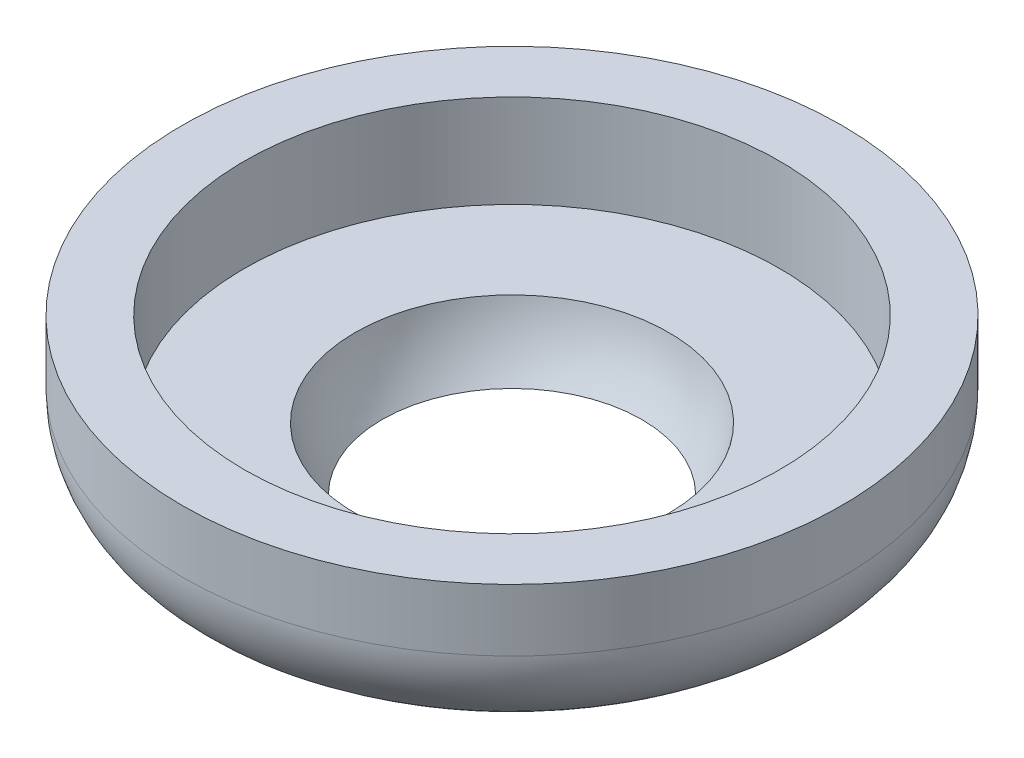
ISO-10303-21;
HEADER;
FILE_DESCRIPTION(('STEP AP214'),'2;1');
FILE_NAME('part.step','',(''),(''),'','','');
FILE_SCHEMA(('AUTOMOTIVE_DESIGN { 1 0 10303 214 1 1 1 1 }'));
ENDSEC;
DATA;
#1=APPLICATION_CONTEXT('core data for automotive mechanical design processes');
#2=APPLICATION_PROTOCOL_DEFINITION('international standard','automotive_design',2000,#1);
#3=PRODUCT_CONTEXT('',#1,'mechanical');
#4=PRODUCT('Part','Part','',(#3));
#5=PRODUCT_RELATED_PRODUCT_CATEGORY('part','',(#4));
#6=PRODUCT_DEFINITION_FORMATION('','',#4);
#7=PRODUCT_DEFINITION_CONTEXT('part definition',#1,'design');
#8=PRODUCT_DEFINITION('design','',#6,#7);
#9=PRODUCT_DEFINITION_SHAPE('','',#8);
#10=(LENGTH_UNIT() NAMED_UNIT(*) SI_UNIT(.MILLI.,.METRE.));
#11=(NAMED_UNIT(*) PLANE_ANGLE_UNIT() SI_UNIT($,.RADIAN.));
#12=(NAMED_UNIT(*) SI_UNIT($,.STERADIAN.) SOLID_ANGLE_UNIT());
#13=UNCERTAINTY_MEASURE_WITH_UNIT(LENGTH_MEASURE(1.E-05),#10,'distance_accuracy_value','');
#14=(GEOMETRIC_REPRESENTATION_CONTEXT(3) GLOBAL_UNCERTAINTY_ASSIGNED_CONTEXT((#13)) GLOBAL_UNIT_ASSIGNED_CONTEXT((#10,
#11,#12)) REPRESENTATION_CONTEXT('',''));
#15=CARTESIAN_POINT('',(0.,0.,0.));
#16=DIRECTION('',(0.,0.,1.));
#17=DIRECTION('',(1.,0.,0.));
#18=AXIS2_PLACEMENT_3D('',#15,#16,#17);
#19=CARTESIAN_POINT('',(0.,5.,0.));
#20=DIRECTION('',(0.,-1.,0.));
#21=DIRECTION('',(0.,0.,-1.));
#22=AXIS2_PLACEMENT_3D('',#19,#20,#21);
#23=CYLINDRICAL_SURFACE('',#22,8.625);
#24=CARTESIAN_POINT('',(0.,2.,0.));
#25=DIRECTION('',(0.,1.,0.));
#26=DIRECTION('',(0.,0.,1.));
#27=AXIS2_PLACEMENT_3D('',#24,#25,#26);
#28=CIRCLE('',#27,8.625);
#29=CARTESIAN_POINT('',(0.,2.,8.625));
#30=VERTEX_POINT('',#29);
#31=EDGE_CURVE('E50',#30,#30,#28,.T.);
#32=ORIENTED_EDGE('',*,*,#31,.F.);
#33=EDGE_LOOP('',(#32));
#34=FACE_BOUND('',#33,.T.);
#35=CARTESIAN_POINT('',(0.,5.,0.));
#36=DIRECTION('',(0.,1.,0.));
#37=DIRECTION('',(0.,0.,1.));
#38=AXIS2_PLACEMENT_3D('',#35,#36,#37);
#39=CIRCLE('',#38,8.625);
#40=CARTESIAN_POINT('',(0.,5.,8.625));
#41=VERTEX_POINT('',#40);
#42=EDGE_CURVE('E63',#41,#41,#39,.T.);
#43=ORIENTED_EDGE('',*,*,#42,.T.);
#44=EDGE_LOOP('',(#43));
#45=FACE_BOUND('',#44,.T.);
#46=ADVANCED_FACE('F39',(#34,#45),#23,.F.);
#47=CARTESIAN_POINT('',(0.,5.,0.));
#48=DIRECTION('',(0.,-1.,0.));
#49=DIRECTION('',(0.,0.,-1.));
#50=AXIS2_PLACEMENT_3D('',#47,#48,#49);
#51=CYLINDRICAL_SURFACE('',#50,10.625);
#52=CARTESIAN_POINT('',(0.,3.,0.));
#53=DIRECTION('',(0.,1.,0.));
#54=DIRECTION('',(0.,0.,1.));
#55=AXIS2_PLACEMENT_3D('',#52,#53,#54);
#56=CIRCLE('',#55,10.625);
#57=CARTESIAN_POINT('',(0.,3.,10.625));
#58=VERTEX_POINT('',#57);
#59=EDGE_CURVE('E46',#58,#58,#56,.T.);
#60=ORIENTED_EDGE('',*,*,#59,.T.);
#61=EDGE_LOOP('',(#60));
#62=FACE_BOUND('',#61,.T.);
#63=CARTESIAN_POINT('',(0.,5.,0.));
#64=DIRECTION('',(0.,1.,0.));
#65=DIRECTION('',(0.,0.,1.));
#66=AXIS2_PLACEMENT_3D('',#63,#64,#65);
#67=CIRCLE('',#66,10.625);
#68=CARTESIAN_POINT('',(0.,5.,10.625));
#69=VERTEX_POINT('',#68);
#70=EDGE_CURVE('E54',#69,#69,#67,.T.);
#71=ORIENTED_EDGE('',*,*,#70,.F.);
#72=EDGE_LOOP('',(#71));
#73=FACE_BOUND('',#72,.T.);
#74=ADVANCED_FACE('F85',(#62,#73),#51,.T.);
#75=CARTESIAN_POINT('',(0.,5.,0.));
#76=DIRECTION('',(0.,1.,0.));
#77=DIRECTION('',(0.,0.,1.));
#78=AXIS2_PLACEMENT_3D('',#75,#76,#77);
#79=PLANE('',#78);
#80=ORIENTED_EDGE('',*,*,#42,.F.);
#81=EDGE_LOOP('',(#80));
#82=FACE_BOUND('',#81,.T.);
#83=ORIENTED_EDGE('',*,*,#70,.T.);
#84=EDGE_LOOP('',(#83));
#85=FACE_BOUND('',#84,.T.);
#86=ADVANCED_FACE('F90',(#82,#85),#79,.T.);
#87=CARTESIAN_POINT('',(0.,0.,0.));
#88=DIRECTION('',(0.,1.,0.));
#89=DIRECTION('',(0.,0.,1.));
#90=AXIS2_PLACEMENT_3D('',#87,#88,#89);
#91=PLANE('',#90);
#92=CARTESIAN_POINT('',(0.,0.,0.));
#93=DIRECTION('',(0.,1.,0.));
#94=DIRECTION('',(0.,0.,1.));
#95=AXIS2_PLACEMENT_3D('',#92,#93,#94);
#96=CIRCLE('',#95,7.625);
#97=CARTESIAN_POINT('',(0.,0.,7.625));
#98=VERTEX_POINT('',#97);
#99=EDGE_CURVE('E10',#98,#98,#96,.F.);
#100=ORIENTED_EDGE('',*,*,#99,.T.);
#101=EDGE_LOOP('',(#100));
#102=FACE_BOUND('',#101,.T.);
#103=CARTESIAN_POINT('',(0.,0.,0.));
#104=DIRECTION('',(0.,1.,0.));
#105=DIRECTION('',(0.,0.,1.));
#106=AXIS2_PLACEMENT_3D('',#103,#104,#105);
#107=CIRCLE('',#106,4.18598853319022);
#108=CARTESIAN_POINT('',(4.18598853319022,0.,0.));
#109=VERTEX_POINT('',#108);
#110=EDGE_CURVE('E59',#109,#109,#107,.T.);
#111=ORIENTED_EDGE('',*,*,#110,.T.);
#112=EDGE_LOOP('',(#111));
#113=FACE_BOUND('',#112,.T.);
#114=ADVANCED_FACE('F69',(#102,#113),#91,.F.);
#115=CARTESIAN_POINT('',(0.,2.,0.));
#116=DIRECTION('',(0.,1.,0.));
#117=DIRECTION('',(0.,0.,1.));
#118=AXIS2_PLACEMENT_3D('',#115,#116,#117);
#119=PLANE('',#118);
#120=CARTESIAN_POINT('',(0.,2.,0.));
#121=DIRECTION('',(0.,1.,0.));
#122=DIRECTION('',(0.,0.,1.));
#123=AXIS2_PLACEMENT_3D('',#120,#121,#122);
#124=CIRCLE('',#123,5.0519798099359);
#125=CARTESIAN_POINT('',(5.0519798099359,2.,0.));
#126=VERTEX_POINT('',#125);
#127=EDGE_CURVE('E57',#126,#126,#124,.T.);
#128=ORIENTED_EDGE('',*,*,#127,.F.);
#129=EDGE_LOOP('',(#128));
#130=FACE_BOUND('',#129,.T.);
#131=ORIENTED_EDGE('',*,*,#31,.T.);
#132=EDGE_LOOP('',(#131));
#133=FACE_BOUND('',#132,.T.);
#134=ADVANCED_FACE('F73',(#130,#133),#119,.T.);
#135=CARTESIAN_POINT('',(0.,3.,0.));
#136=DIRECTION('',(0.,1.,0.));
#137=DIRECTION('',(1.,0.,0.));
#138=AXIS2_PLACEMENT_3D('',#135,#136,#137);
#139=SPHERICAL_SURFACE('',#138,5.15);
#140=CARTESIAN_POINT('',(5.0519798099359,2.,0.));
#141=CARTESIAN_POINT('',(5.04753799944321,1.97756001302309,0.));
#142=CARTESIAN_POINT('',(5.04294665870871,1.95514962461994,0.));
#143=CARTESIAN_POINT('',(5.03346577377949,1.91039201542144,0.));
#144=CARTESIAN_POINT('',(5.02857622958476,1.8880447946261,0.));
#145=CARTESIAN_POINT('',(5.01849979475849,1.84341749110352,0.));
#146=CARTESIAN_POINT('',(5.01331290412693,1.82113740837628,0.));
#147=CARTESIAN_POINT('',(5.00264270043686,1.7766483365234,0.));
#148=CARTESIAN_POINT('',(4.99715938737834,1.75443934739776,0.));
#149=CARTESIAN_POINT('',(4.98589731167683,1.71009640646311,0.));
#150=CARTESIAN_POINT('',(4.98011854903384,1.68796245465411,0.));
#151=CARTESIAN_POINT('',(4.96826660048613,1.64377351852797,0.));
#152=CARTESIAN_POINT('',(4.96219341458141,1.62171853421084,0.));
#153=CARTESIAN_POINT('',(4.94975369783939,1.57769144927962,0.));
#154=CARTESIAN_POINT('',(4.94338716700208,1.55571934866553,0.));
#155=CARTESIAN_POINT('',(4.93036189088501,1.51186193261882,0.));
#156=CARTESIAN_POINT('',(4.92370314560524,1.48997661718619,0.));
#157=CARTESIAN_POINT('',(4.91009462296093,1.44629665757493,0.));
#158=CARTESIAN_POINT('',(4.90314484559639,1.42450201339629,0.));
#159=CARTESIAN_POINT('',(4.88895549282263,1.38100726626437,0.));
#160=CARTESIAN_POINT('',(4.88171591741342,1.35930716331109,0.));
#161=CARTESIAN_POINT('',(4.8669482540471,1.31600535181428,0.));
#162=CARTESIAN_POINT('',(4.85942016608999,1.29440364327076,0.));
#163=CARTESIAN_POINT('',(4.84407681435482,1.25130245630639,0.));
#164=CARTESIAN_POINT('',(4.83626155057676,1.22980297788554,0.));
#165=CARTESIAN_POINT('',(4.820345234919,1.18691006872693,0.));
#166=CARTESIAN_POINT('',(4.81224418303929,1.16551663798917,0.));
#167=CARTESIAN_POINT('',(4.79575772964359,1.12283962292675,0.));
#168=CARTESIAN_POINT('',(4.7873723281276,1.10155603860209,0.));
#169=CARTESIAN_POINT('',(4.7703186644153,1.059102495591,0.));
#170=CARTESIAN_POINT('',(4.761650402219,1.03793253690457,0.));
#171=CARTESIAN_POINT('',(4.74403255632827,0.995710004219079,0.));
#172=CARTESIAN_POINT('',(4.73508297263386,0.974657430220021,0.));
#173=CARTESIAN_POINT('',(4.71690407288204,0.932673405114989,0.));
#174=CARTESIAN_POINT('',(4.70767475682464,0.911741954009015,0.));
#175=CARTESIAN_POINT('',(4.68893803115274,0.870003891388641,0.));
#176=CARTESIAN_POINT('',(4.67943062153823,0.849197279874241,0.));
#177=CARTESIAN_POINT('',(4.66013939693774,0.807712590968333,0.));
#178=CARTESIAN_POINT('',(4.65035558195176,0.787034513576825,0.));
#179=CARTESIAN_POINT('',(4.63051328387394,0.745810564624822,0.));
#180=CARTESIAN_POINT('',(4.6204548007821,0.725264693064327,0.));
#181=CARTESIAN_POINT('',(4.60006495252969,0.684308804007314,0.));
#182=CARTESIAN_POINT('',(4.58973358736913,0.663898786510796,0.));
#183=CARTESIAN_POINT('',(4.56879980947079,0.623218229691722,0.));
#184=CARTESIAN_POINT('',(4.55819739673303,0.602947690369167,0.));
#185=CARTESIAN_POINT('',(4.53672340630036,0.562549689241586,0.));
#186=CARTESIAN_POINT('',(4.52585182860547,0.54242222743656,0.));
#187=CARTESIAN_POINT('',(4.50384143867329,0.50231395528179,0.));
#188=CARTESIAN_POINT('',(4.492702626436,0.482333144932045,0.));
#189=CARTESIAN_POINT('',(4.47015974528416,0.442521723586204,0.));
#190=CARTESIAN_POINT('',(4.4587556763696,0.422691112590109,0.));
#191=CARTESIAN_POINT('',(4.43568430683312,0.383183611176683,0.));
#192=CARTESIAN_POINT('',(4.4240170062112,0.363506720759352,0.));
#193=CARTESIAN_POINT('',(4.40042124495425,0.324310154444587,0.));
#194=CARTESIAN_POINT('',(4.38849278431923,0.304790478547153,0.));
#195=CARTESIAN_POINT('',(4.36437682116463,0.265911807254739,0.));
#196=CARTESIAN_POINT('',(4.35218931864506,0.246552811859759,0.));
#197=CARTESIAN_POINT('',(4.32755743561784,0.207998939183031,0.));
#198=CARTESIAN_POINT('',(4.31511305511019,0.188804061901282,0.));
#199=CARTESIAN_POINT('',(4.28996962647025,0.150581833324887,0.));
#200=CARTESIAN_POINT('',(4.27727057833795,0.131554482030241,0.));
#201=CARTESIAN_POINT('',(4.25162006684375,0.0936706857765509,0.));
#202=CARTESIAN_POINT('',(4.23866860348186,0.0748142408175067,0.));
#203=CARTESIAN_POINT('',(4.21251557064335,0.0372755989460359,0.));
#204=CARTESIAN_POINT('',(4.19931400116674,0.0185934020336093,0.));
#205=CARTESIAN_POINT('',(4.18598853319022,0.,0.));
#206=B_SPLINE_CURVE_WITH_KNOTS('',3,(#140,#141,#142,#143,#144,#145,#146,#147,#148,#149,#150,
#151,#152,#153,#154,#155,#156,#157,#158,#159,#160,#161,#162,#163,#164,#165,#166,#167,#168,#169,
#170,#171,#172,#173,#174,#175,#176,#177,#178,#179,#180,#181,#182,#183,#184,#185,#186,#187,#188,
#189,#190,#191,#192,#193,#194,#195,#196,#197,#198,#199,#200,#201,#202,#203,#204,#205),
.UNSPECIFIED.,.F.,.F.,(4,2,2,2,2,2,2,2,2,2,2,2,2,2,2,2,2,2,2,2,2,2,2,2,2,2,2,2,2,2,2,2,4),(0.,
0.0686256112823554,0.137251222564711,0.205876833847066,0.274502445129421,0.343128056411776,
0.411753667694131,0.480379278976487,0.549004890258841,0.617630501541197,0.686256112823552,
0.754881724105907,0.823507335388262,0.892132946670617,0.960758557952973,1.02938416923533,
1.09800978051768,1.16663539180004,1.23526100308239,1.30388661436475,1.3725122256471,
1.44113783692946,1.50976344821181,1.57838905949417,1.64701467077652,1.71564028205888,
1.78426589334123,1.85289150462359,1.92151711590594,1.9901427271883,2.05876833847065,
2.12739394975301,2.19601956103537),.UNSPECIFIED.);
#207=EDGE_CURVE('BSEAM71',#126,#109,#206,.T.);
#208=ORIENTED_EDGE('',*,*,#127,.T.);
#209=ORIENTED_EDGE('',*,*,#110,.F.);
#210=ORIENTED_EDGE('',*,*,#207,.T.);
#211=ORIENTED_EDGE('',*,*,#207,.F.);
#212=EDGE_LOOP('',(#208,#210,#209,#211));
#213=FACE_BOUND('',#212,.T.);
#214=ADVANCED_FACE('F71',(#213),#139,.F.);
#215=CARTESIAN_POINT('',(0.,3.,0.));
#216=DIRECTION('',(0.,1.,0.));
#217=DIRECTION('',(0.,0.,1.));
#218=AXIS2_PLACEMENT_3D('',#215,#216,#217);
#219=TOROIDAL_SURFACE('',#218,7.625,3.);
#220=ORIENTED_EDGE('',*,*,#99,.F.);
#221=EDGE_LOOP('',(#220));
#222=FACE_BOUND('',#221,.T.);
#223=ORIENTED_EDGE('',*,*,#59,.F.);
#224=EDGE_LOOP('',(#223));
#225=FACE_BOUND('',#224,.T.);
#226=ADVANCED_FACE('F41',(#222,#225),#219,.T.);
#227=CLOSED_SHELL('',(#46,#74,#86,#114,#134,#214,#226));
#228=MANIFOLD_SOLID_BREP('B2',#227);
#229=ADVANCED_BREP_SHAPE_REPRESENTATION('',(#18,#228),#14);
#230=SHAPE_DEFINITION_REPRESENTATION(#9,#229);
ENDSEC;
END-ISO-10303-21;
